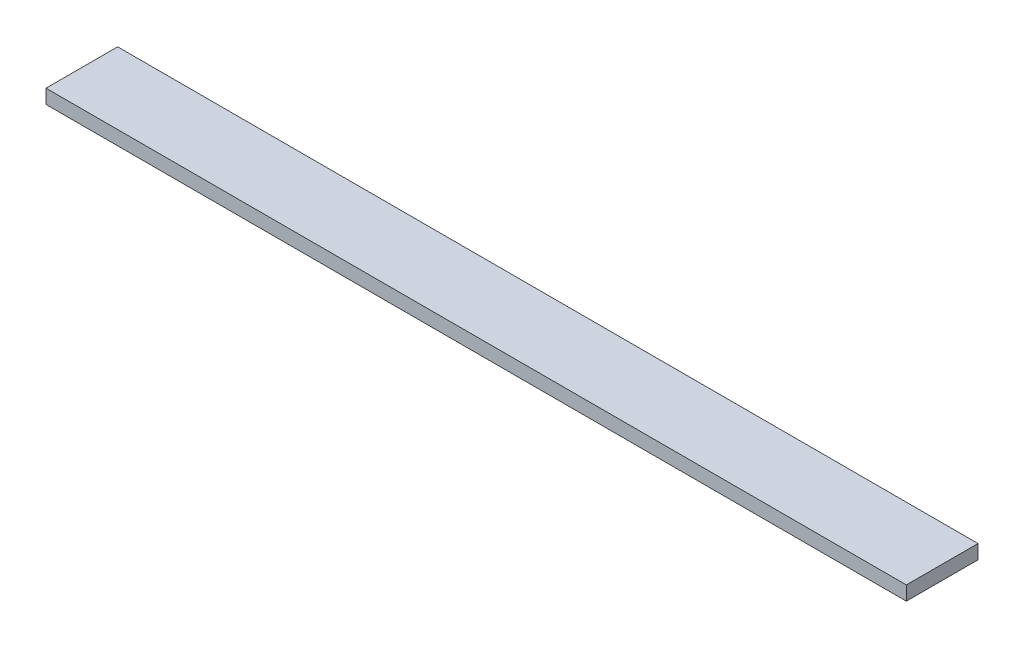
ISO-10303-21;
HEADER;
FILE_DESCRIPTION(('STEP AP214'),'2;1');
FILE_NAME('part.step','',(''),(''),'','','');
FILE_SCHEMA(('AUTOMOTIVE_DESIGN { 1 0 10303 214 1 1 1 1 }'));
ENDSEC;
DATA;
#1=APPLICATION_CONTEXT('core data for automotive mechanical design processes');
#2=APPLICATION_PROTOCOL_DEFINITION('international standard','automotive_design',2000,#1);
#3=PRODUCT_CONTEXT('',#1,'mechanical');
#4=PRODUCT('Part','Part','',(#3));
#5=PRODUCT_RELATED_PRODUCT_CATEGORY('part','',(#4));
#6=PRODUCT_DEFINITION_FORMATION('','',#4);
#7=PRODUCT_DEFINITION_CONTEXT('part definition',#1,'design');
#8=PRODUCT_DEFINITION('design','',#6,#7);
#9=PRODUCT_DEFINITION_SHAPE('','',#8);
#10=(LENGTH_UNIT() NAMED_UNIT(*) SI_UNIT(.MILLI.,.METRE.));
#11=(NAMED_UNIT(*) PLANE_ANGLE_UNIT() SI_UNIT($,.RADIAN.));
#12=(NAMED_UNIT(*) SI_UNIT($,.STERADIAN.) SOLID_ANGLE_UNIT());
#13=UNCERTAINTY_MEASURE_WITH_UNIT(LENGTH_MEASURE(1.E-05),#10,'distance_accuracy_value','');
#14=(GEOMETRIC_REPRESENTATION_CONTEXT(3) GLOBAL_UNCERTAINTY_ASSIGNED_CONTEXT((#13)) GLOBAL_UNIT_ASSIGNED_CONTEXT((#10,
#11,#12)) REPRESENTATION_CONTEXT('',''));
#15=CARTESIAN_POINT('',(0.,0.,0.));
#16=DIRECTION('',(0.,0.,1.));
#17=DIRECTION('',(1.,0.,0.));
#18=AXIS2_PLACEMENT_3D('',#15,#16,#17);
#19=CARTESIAN_POINT('',(252.5,-3.,-5.));
#20=DIRECTION('',(-1.,0.,0.));
#21=DIRECTION('',(0.,0.,1.));
#22=AXIS2_PLACEMENT_3D('',#19,#20,#21);
#23=PLANE('',#22);
#24=DIRECTION('',(0.,0.,1.));
#25=VECTOR('',#24,1.);
#26=CARTESIAN_POINT('',(252.5,-2.5,-5.));
#27=LINE('',#26,#25);
#28=CARTESIAN_POINT('',(252.5,-2.5,-5.));
#29=VERTEX_POINT('',#28);
#30=CARTESIAN_POINT('',(252.5,-2.5,5.));
#31=VERTEX_POINT('',#30);
#32=EDGE_CURVE('E110',#29,#31,#27,.T.);
#33=ORIENTED_EDGE('',*,*,#32,.T.);
#34=DIRECTION('',(0.,1.,0.));
#35=VECTOR('',#34,1.);
#36=CARTESIAN_POINT('',(252.5,-3.,5.));
#37=LINE('',#36,#35);
#38=CARTESIAN_POINT('',(252.5,-3.,5.));
#39=VERTEX_POINT('',#38);
#40=EDGE_CURVE('E12',#39,#31,#37,.T.);
#41=ORIENTED_EDGE('',*,*,#40,.F.);
#42=DIRECTION('',(0.,0.,1.));
#43=VECTOR('',#42,1.);
#44=CARTESIAN_POINT('',(252.5,-3.,-5.));
#45=LINE('',#44,#43);
#46=CARTESIAN_POINT('',(252.5,-3.,-5.));
#47=VERTEX_POINT('',#46);
#48=EDGE_CURVE('E98',#47,#39,#45,.T.);
#49=ORIENTED_EDGE('',*,*,#48,.F.);
#50=DIRECTION('',(0.,1.,0.));
#51=VECTOR('',#50,1.);
#52=CARTESIAN_POINT('',(252.5,-3.,-5.));
#53=LINE('',#52,#51);
#54=EDGE_CURVE('E106',#47,#29,#53,.T.);
#55=ORIENTED_EDGE('',*,*,#54,.T.);
#56=EDGE_LOOP('',(#33,#41,#49,#55));
#57=FACE_BOUND('',#56,.T.);
#58=ADVANCED_FACE('F47',(#57),#23,.F.);
#59=CARTESIAN_POINT('',(52.5,-3.,5.));
#60=DIRECTION('',(0.,0.,-1.));
#61=DIRECTION('',(-1.,0.,0.));
#62=AXIS2_PLACEMENT_3D('',#59,#60,#61);
#63=PLANE('',#62);
#64=DIRECTION('',(-1.,0.,0.));
#65=VECTOR('',#64,1.);
#66=CARTESIAN_POINT('',(52.5,-2.5,5.));
#67=LINE('',#66,#65);
#68=CARTESIAN_POINT('',(52.5,-2.5,5.));
#69=VERTEX_POINT('',#68);
#70=EDGE_CURVE('E102',#31,#69,#67,.T.);
#71=ORIENTED_EDGE('',*,*,#70,.T.);
#72=DIRECTION('',(0.,1.,0.));
#73=VECTOR('',#72,1.);
#74=CARTESIAN_POINT('',(52.5,-3.,5.));
#75=LINE('',#74,#73);
#76=CARTESIAN_POINT('',(52.5,-3.,5.));
#77=VERTEX_POINT('',#76);
#78=EDGE_CURVE('E55',#77,#69,#75,.T.);
#79=ORIENTED_EDGE('',*,*,#78,.F.);
#80=DIRECTION('',(-1.,0.,0.));
#81=VECTOR('',#80,1.);
#82=CARTESIAN_POINT('',(52.5,-3.,5.));
#83=LINE('',#82,#81);
#84=EDGE_CURVE('E93',#39,#77,#83,.T.);
#85=ORIENTED_EDGE('',*,*,#84,.F.);
#86=ORIENTED_EDGE('',*,*,#40,.T.);
#87=EDGE_LOOP('',(#71,#79,#85,#86));
#88=FACE_BOUND('',#87,.T.);
#89=ADVANCED_FACE('F101',(#88),#63,.F.);
#90=CARTESIAN_POINT('',(52.5,-3.,-5.));
#91=DIRECTION('',(1.,0.,0.));
#92=DIRECTION('',(0.,0.,-1.));
#93=AXIS2_PLACEMENT_3D('',#90,#91,#92);
#94=PLANE('',#93);
#95=DIRECTION('',(0.,0.,-1.));
#96=VECTOR('',#95,1.);
#97=CARTESIAN_POINT('',(52.5,-2.5,-5.));
#98=LINE('',#97,#96);
#99=CARTESIAN_POINT('',(52.5,-2.5,-5.));
#100=VERTEX_POINT('',#99);
#101=EDGE_CURVE('E80',#69,#100,#98,.T.);
#102=ORIENTED_EDGE('',*,*,#101,.T.);
#103=DIRECTION('',(0.,1.,0.));
#104=VECTOR('',#103,1.);
#105=CARTESIAN_POINT('',(52.5,-3.,-5.));
#106=LINE('',#105,#104);
#107=CARTESIAN_POINT('',(52.5,-3.,-5.));
#108=VERTEX_POINT('',#107);
#109=EDGE_CURVE('E103',#108,#100,#106,.T.);
#110=ORIENTED_EDGE('',*,*,#109,.F.);
#111=DIRECTION('',(0.,0.,-1.));
#112=VECTOR('',#111,1.);
#113=CARTESIAN_POINT('',(52.5,-3.,-5.));
#114=LINE('',#113,#112);
#115=EDGE_CURVE('E96',#77,#108,#114,.T.);
#116=ORIENTED_EDGE('',*,*,#115,.F.);
#117=ORIENTED_EDGE('',*,*,#78,.T.);
#118=EDGE_LOOP('',(#102,#110,#116,#117));
#119=FACE_BOUND('',#118,.T.);
#120=ADVANCED_FACE('F104',(#119),#94,.F.);
#121=CARTESIAN_POINT('',(52.5,-3.,-5.));
#122=DIRECTION('',(0.,0.,1.));
#123=DIRECTION('',(1.,0.,0.));
#124=AXIS2_PLACEMENT_3D('',#121,#122,#123);
#125=PLANE('',#124);
#126=DIRECTION('',(1.,0.,0.));
#127=VECTOR('',#126,1.);
#128=CARTESIAN_POINT('',(52.5,-2.5,-5.));
#129=LINE('',#128,#127);
#130=EDGE_CURVE('E86',#100,#29,#129,.T.);
#131=ORIENTED_EDGE('',*,*,#130,.T.);
#132=ORIENTED_EDGE('',*,*,#54,.F.);
#133=DIRECTION('',(1.,0.,0.));
#134=VECTOR('',#133,1.);
#135=CARTESIAN_POINT('',(52.5,-3.,-5.));
#136=LINE('',#135,#134);
#137=EDGE_CURVE('E63',#108,#47,#136,.T.);
#138=ORIENTED_EDGE('',*,*,#137,.F.);
#139=ORIENTED_EDGE('',*,*,#109,.T.);
#140=EDGE_LOOP('',(#131,#132,#138,#139));
#141=FACE_BOUND('',#140,.T.);
#142=ADVANCED_FACE('F117',(#141),#125,.F.);
#143=CARTESIAN_POINT('',(0.,-3.,0.));
#144=DIRECTION('',(0.,1.,0.));
#145=DIRECTION('',(0.,0.,1.));
#146=AXIS2_PLACEMENT_3D('',#143,#144,#145);
#147=PLANE('',#146);
#148=ORIENTED_EDGE('',*,*,#48,.T.);
#149=ORIENTED_EDGE('',*,*,#84,.T.);
#150=ORIENTED_EDGE('',*,*,#115,.T.);
#151=ORIENTED_EDGE('',*,*,#137,.T.);
#152=EDGE_LOOP('',(#148,#149,#150,#151));
#153=FACE_BOUND('',#152,.T.);
#154=ADVANCED_FACE('F94',(#153),#147,.F.);
#155=CARTESIAN_POINT('',(0.,-2.5,0.));
#156=DIRECTION('',(0.,1.,0.));
#157=DIRECTION('',(0.,0.,1.));
#158=AXIS2_PLACEMENT_3D('',#155,#156,#157);
#159=PLANE('',#158);
#160=ORIENTED_EDGE('',*,*,#32,.F.);
#161=ORIENTED_EDGE('',*,*,#130,.F.);
#162=ORIENTED_EDGE('',*,*,#101,.F.);
#163=ORIENTED_EDGE('',*,*,#70,.F.);
#164=EDGE_LOOP('',(#160,#161,#162,#163));
#165=FACE_BOUND('',#164,.T.);
#166=ADVANCED_FACE('F120',(#165),#159,.T.);
#167=CLOSED_SHELL('',(#58,#89,#120,#142,#154,#166));
#168=MANIFOLD_SOLID_BREP('B2',#167);
#169=CARTESIAN_POINT('',(305.,-2.5,-12.7));
#170=DIRECTION('',(0.,0.,1.));
#171=DIRECTION('',(1.,0.,0.));
#172=AXIS2_PLACEMENT_3D('',#169,#170,#171);
#173=PLANE('',#172);
#174=DIRECTION('',(0.,1.,0.));
#175=VECTOR('',#174,1.);
#176=CARTESIAN_POINT('',(0.,-2.5,-12.7));
#177=LINE('',#176,#175);
#178=CARTESIAN_POINT('',(0.,-2.5,-12.7));
#179=VERTEX_POINT('',#178);
#180=CARTESIAN_POINT('',(0.,2.5,-12.7));
#181=VERTEX_POINT('',#180);
#182=EDGE_CURVE('E236',#179,#181,#177,.T.);
#183=ORIENTED_EDGE('',*,*,#182,.T.);
#184=DIRECTION('',(-1.,0.,0.));
#185=VECTOR('',#184,1.);
#186=CARTESIAN_POINT('',(305.,2.5,-12.7));
#187=LINE('',#186,#185);
#188=CARTESIAN_POINT('',(305.,2.5,-12.7));
#189=VERTEX_POINT('',#188);
#190=EDGE_CURVE('E45',#189,#181,#187,.T.);
#191=ORIENTED_EDGE('',*,*,#190,.F.);
#192=DIRECTION('',(0.,1.,0.));
#193=VECTOR('',#192,1.);
#194=CARTESIAN_POINT('',(305.,-2.5,-12.7));
#195=LINE('',#194,#193);
#196=CARTESIAN_POINT('',(305.,-2.5,-12.7));
#197=VERTEX_POINT('',#196);
#198=EDGE_CURVE('E224',#197,#189,#195,.T.);
#199=ORIENTED_EDGE('',*,*,#198,.F.);
#200=DIRECTION('',(-1.,0.,0.));
#201=VECTOR('',#200,1.);
#202=CARTESIAN_POINT('',(305.,-2.5,-12.7));
#203=LINE('',#202,#201);
#204=EDGE_CURVE('E232',#197,#179,#203,.T.);
#205=ORIENTED_EDGE('',*,*,#204,.T.);
#206=EDGE_LOOP('',(#183,#191,#199,#205));
#207=FACE_BOUND('',#206,.T.);
#208=ADVANCED_FACE('F173',(#207),#173,.F.);
#209=CARTESIAN_POINT('',(305.,2.5,12.7));
#210=DIRECTION('',(0.,-1.,0.));
#211=DIRECTION('',(0.,0.,-1.));
#212=AXIS2_PLACEMENT_3D('',#209,#210,#211);
#213=PLANE('',#212);
#214=DIRECTION('',(0.,0.,1.));
#215=VECTOR('',#214,1.);
#216=CARTESIAN_POINT('',(0.,2.5,12.7));
#217=LINE('',#216,#215);
#218=CARTESIAN_POINT('',(0.,2.5,12.7));
#219=VERTEX_POINT('',#218);
#220=EDGE_CURVE('E228',#181,#219,#217,.T.);
#221=ORIENTED_EDGE('',*,*,#220,.T.);
#222=DIRECTION('',(-1.,0.,0.));
#223=VECTOR('',#222,1.);
#224=CARTESIAN_POINT('',(305.,2.5,12.7));
#225=LINE('',#224,#223);
#226=CARTESIAN_POINT('',(305.,2.5,12.7));
#227=VERTEX_POINT('',#226);
#228=EDGE_CURVE('E181',#227,#219,#225,.T.);
#229=ORIENTED_EDGE('',*,*,#228,.F.);
#230=DIRECTION('',(0.,0.,1.));
#231=VECTOR('',#230,1.);
#232=CARTESIAN_POINT('',(305.,2.5,12.7));
#233=LINE('',#232,#231);
#234=EDGE_CURVE('E219',#189,#227,#233,.T.);
#235=ORIENTED_EDGE('',*,*,#234,.F.);
#236=ORIENTED_EDGE('',*,*,#190,.T.);
#237=EDGE_LOOP('',(#221,#229,#235,#236));
#238=FACE_BOUND('',#237,.T.);
#239=ADVANCED_FACE('F227',(#238),#213,.F.);
#240=CARTESIAN_POINT('',(305.,-2.5,12.7));
#241=DIRECTION('',(0.,0.,-1.));
#242=DIRECTION('',(-1.,0.,0.));
#243=AXIS2_PLACEMENT_3D('',#240,#241,#242);
#244=PLANE('',#243);
#245=DIRECTION('',(0.,-1.,0.));
#246=VECTOR('',#245,1.);
#247=CARTESIAN_POINT('',(0.,-2.5,12.7));
#248=LINE('',#247,#246);
#249=CARTESIAN_POINT('',(0.,-2.5,12.7));
#250=VERTEX_POINT('',#249);
#251=EDGE_CURVE('E206',#219,#250,#248,.T.);
#252=ORIENTED_EDGE('',*,*,#251,.T.);
#253=DIRECTION('',(-1.,0.,0.));
#254=VECTOR('',#253,1.);
#255=CARTESIAN_POINT('',(305.,-2.5,12.7));
#256=LINE('',#255,#254);
#257=CARTESIAN_POINT('',(305.,-2.5,12.7));
#258=VERTEX_POINT('',#257);
#259=EDGE_CURVE('E229',#258,#250,#256,.T.);
#260=ORIENTED_EDGE('',*,*,#259,.F.);
#261=DIRECTION('',(0.,-1.,0.));
#262=VECTOR('',#261,1.);
#263=CARTESIAN_POINT('',(305.,-2.5,12.7));
#264=LINE('',#263,#262);
#265=EDGE_CURVE('E222',#227,#258,#264,.T.);
#266=ORIENTED_EDGE('',*,*,#265,.F.);
#267=ORIENTED_EDGE('',*,*,#228,.T.);
#268=EDGE_LOOP('',(#252,#260,#266,#267));
#269=FACE_BOUND('',#268,.T.);
#270=ADVANCED_FACE('F230',(#269),#244,.F.);
#271=CARTESIAN_POINT('',(305.,-2.5,12.7));
#272=DIRECTION('',(0.,1.,0.));
#273=DIRECTION('',(0.,0.,1.));
#274=AXIS2_PLACEMENT_3D('',#271,#272,#273);
#275=PLANE('',#274);
#276=DIRECTION('',(0.,0.,-1.));
#277=VECTOR('',#276,1.);
#278=CARTESIAN_POINT('',(0.,-2.5,12.7));
#279=LINE('',#278,#277);
#280=EDGE_CURVE('E212',#250,#179,#279,.T.);
#281=ORIENTED_EDGE('',*,*,#280,.T.);
#282=ORIENTED_EDGE('',*,*,#204,.F.);
#283=DIRECTION('',(0.,0.,-1.));
#284=VECTOR('',#283,1.);
#285=CARTESIAN_POINT('',(305.,-2.5,12.7));
#286=LINE('',#285,#284);
#287=EDGE_CURVE('E189',#258,#197,#286,.T.);
#288=ORIENTED_EDGE('',*,*,#287,.F.);
#289=ORIENTED_EDGE('',*,*,#259,.T.);
#290=EDGE_LOOP('',(#281,#282,#288,#289));
#291=FACE_BOUND('',#290,.T.);
#292=ADVANCED_FACE('F243',(#291),#275,.F.);
#293=CARTESIAN_POINT('',(305.,0.,0.));
#294=DIRECTION('',(-1.,0.,0.));
#295=DIRECTION('',(0.,0.,1.));
#296=AXIS2_PLACEMENT_3D('',#293,#294,#295);
#297=PLANE('',#296);
#298=ORIENTED_EDGE('',*,*,#198,.T.);
#299=ORIENTED_EDGE('',*,*,#234,.T.);
#300=ORIENTED_EDGE('',*,*,#265,.T.);
#301=ORIENTED_EDGE('',*,*,#287,.T.);
#302=EDGE_LOOP('',(#298,#299,#300,#301));
#303=FACE_BOUND('',#302,.T.);
#304=ADVANCED_FACE('F220',(#303),#297,.F.);
#305=CARTESIAN_POINT('',(0.,0.,0.));
#306=DIRECTION('',(-1.,0.,0.));
#307=DIRECTION('',(0.,0.,1.));
#308=AXIS2_PLACEMENT_3D('',#305,#306,#307);
#309=PLANE('',#308);
#310=ORIENTED_EDGE('',*,*,#182,.F.);
#311=ORIENTED_EDGE('',*,*,#280,.F.);
#312=ORIENTED_EDGE('',*,*,#251,.F.);
#313=ORIENTED_EDGE('',*,*,#220,.F.);
#314=EDGE_LOOP('',(#310,#311,#312,#313));
#315=FACE_BOUND('',#314,.T.);
#316=ADVANCED_FACE('F246',(#315),#309,.T.);
#317=CLOSED_SHELL('',(#208,#239,#270,#292,#304,#316));
#318=MANIFOLD_SOLID_BREP('B6',#317);
#319=ADVANCED_BREP_SHAPE_REPRESENTATION('',(#18,#168,#318),#14);
#320=SHAPE_DEFINITION_REPRESENTATION(#9,#319);
ENDSEC;
END-ISO-10303-21;
